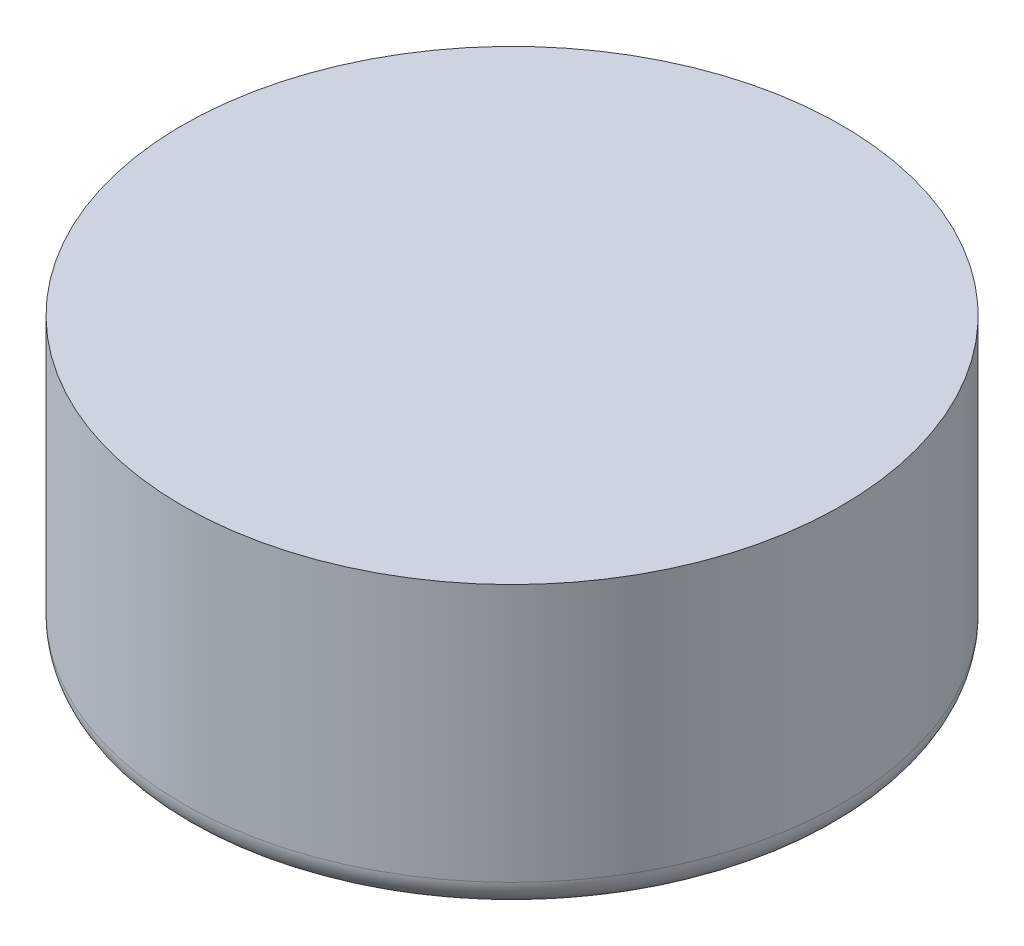
ISO-10303-21;
HEADER;
FILE_DESCRIPTION(('STEP AP214'),'2;1');
FILE_NAME('part.step','',(''),(''),'','','');
FILE_SCHEMA(('AUTOMOTIVE_DESIGN { 1 0 10303 214 1 1 1 1 }'));
ENDSEC;
DATA;
#1=APPLICATION_CONTEXT('core data for automotive mechanical design processes');
#2=APPLICATION_PROTOCOL_DEFINITION('international standard','automotive_design',2000,#1);
#3=PRODUCT_CONTEXT('',#1,'mechanical');
#4=PRODUCT('Part','Part','',(#3));
#5=PRODUCT_RELATED_PRODUCT_CATEGORY('part','',(#4));
#6=PRODUCT_DEFINITION_FORMATION('','',#4);
#7=PRODUCT_DEFINITION_CONTEXT('part definition',#1,'design');
#8=PRODUCT_DEFINITION('design','',#6,#7);
#9=PRODUCT_DEFINITION_SHAPE('','',#8);
#10=(LENGTH_UNIT() NAMED_UNIT(*) SI_UNIT(.MILLI.,.METRE.));
#11=(NAMED_UNIT(*) PLANE_ANGLE_UNIT() SI_UNIT($,.RADIAN.));
#12=(NAMED_UNIT(*) SI_UNIT($,.STERADIAN.) SOLID_ANGLE_UNIT());
#13=UNCERTAINTY_MEASURE_WITH_UNIT(LENGTH_MEASURE(1.E-05),#10,'distance_accuracy_value','');
#14=(GEOMETRIC_REPRESENTATION_CONTEXT(3) GLOBAL_UNCERTAINTY_ASSIGNED_CONTEXT((#13)) GLOBAL_UNIT_ASSIGNED_CONTEXT((#10,
#11,#12)) REPRESENTATION_CONTEXT('',''));
#15=CARTESIAN_POINT('',(0.,0.,0.));
#16=DIRECTION('',(0.,0.,1.));
#17=DIRECTION('',(1.,0.,0.));
#18=AXIS2_PLACEMENT_3D('',#15,#16,#17);
#19=CARTESIAN_POINT('',(0.,12.7,0.));
#20=DIRECTION('',(0.,-1.,0.));
#21=DIRECTION('',(0.,0.,-1.));
#22=AXIS2_PLACEMENT_3D('',#19,#20,#21);
#23=CYLINDRICAL_SURFACE('',#22,14.605);
#24=CARTESIAN_POINT('',(0.,1.27,0.));
#25=DIRECTION('',(0.,1.,0.));
#26=DIRECTION('',(0.,0.,1.));
#27=AXIS2_PLACEMENT_3D('',#24,#25,#26);
#28=CIRCLE('',#27,14.605);
#29=CARTESIAN_POINT('',(0.,1.27,14.605));
#30=VERTEX_POINT('',#29);
#31=EDGE_CURVE('E38',#30,#30,#28,.T.);
#32=ORIENTED_EDGE('',*,*,#31,.T.);
#33=EDGE_LOOP('',(#32));
#34=FACE_BOUND('',#33,.T.);
#35=CARTESIAN_POINT('',(0.,12.7,0.));
#36=DIRECTION('',(0.,1.,0.));
#37=DIRECTION('',(0.,0.,1.));
#38=AXIS2_PLACEMENT_3D('',#35,#36,#37);
#39=CIRCLE('',#38,14.605);
#40=CARTESIAN_POINT('',(0.,12.7,14.605));
#41=VERTEX_POINT('',#40);
#42=EDGE_CURVE('E42',#41,#41,#39,.T.);
#43=ORIENTED_EDGE('',*,*,#42,.F.);
#44=EDGE_LOOP('',(#43));
#45=FACE_BOUND('',#44,.T.);
#46=ADVANCED_FACE('F31',(#34,#45),#23,.T.);
#47=CARTESIAN_POINT('',(0.,12.7,0.));
#48=DIRECTION('',(0.,1.,0.));
#49=DIRECTION('',(0.,0.,1.));
#50=AXIS2_PLACEMENT_3D('',#47,#48,#49);
#51=PLANE('',#50);
#52=ORIENTED_EDGE('',*,*,#42,.T.);
#53=EDGE_LOOP('',(#52));
#54=FACE_BOUND('',#53,.T.);
#55=ADVANCED_FACE('F49',(#54),#51,.T.);
#56=CARTESIAN_POINT('',(0.,0.,0.));
#57=DIRECTION('',(0.,1.,0.));
#58=DIRECTION('',(0.,0.,1.));
#59=AXIS2_PLACEMENT_3D('',#56,#57,#58);
#60=PLANE('',#59);
#61=CARTESIAN_POINT('',(0.,0.,0.));
#62=DIRECTION('',(0.,1.,0.));
#63=DIRECTION('',(0.,0.,1.));
#64=AXIS2_PLACEMENT_3D('',#61,#62,#63);
#65=CIRCLE('',#64,13.335);
#66=CARTESIAN_POINT('',(0.,0.,13.335));
#67=VERTEX_POINT('',#66);
#68=EDGE_CURVE('E10',#67,#67,#65,.F.);
#69=ORIENTED_EDGE('',*,*,#68,.T.);
#70=EDGE_LOOP('',(#69));
#71=FACE_BOUND('',#70,.T.);
#72=ADVANCED_FACE('F55',(#71),#60,.F.);
#73=CARTESIAN_POINT('',(0.,1.27,0.));
#74=DIRECTION('',(0.,1.,0.));
#75=DIRECTION('',(0.,0.,1.));
#76=AXIS2_PLACEMENT_3D('',#73,#74,#75);
#77=TOROIDAL_SURFACE('',#76,13.335,1.27);
#78=ORIENTED_EDGE('',*,*,#68,.F.);
#79=EDGE_LOOP('',(#78));
#80=FACE_BOUND('',#79,.T.);
#81=ORIENTED_EDGE('',*,*,#31,.F.);
#82=EDGE_LOOP('',(#81));
#83=FACE_BOUND('',#82,.T.);
#84=ADVANCED_FACE('F33',(#80,#83),#77,.T.);
#85=CLOSED_SHELL('',(#46,#55,#72,#84));
#86=MANIFOLD_SOLID_BREP('B2',#85);
#87=ADVANCED_BREP_SHAPE_REPRESENTATION('',(#18,#86),#14);
#88=SHAPE_DEFINITION_REPRESENTATION(#9,#87);
ENDSEC;
END-ISO-10303-21;
